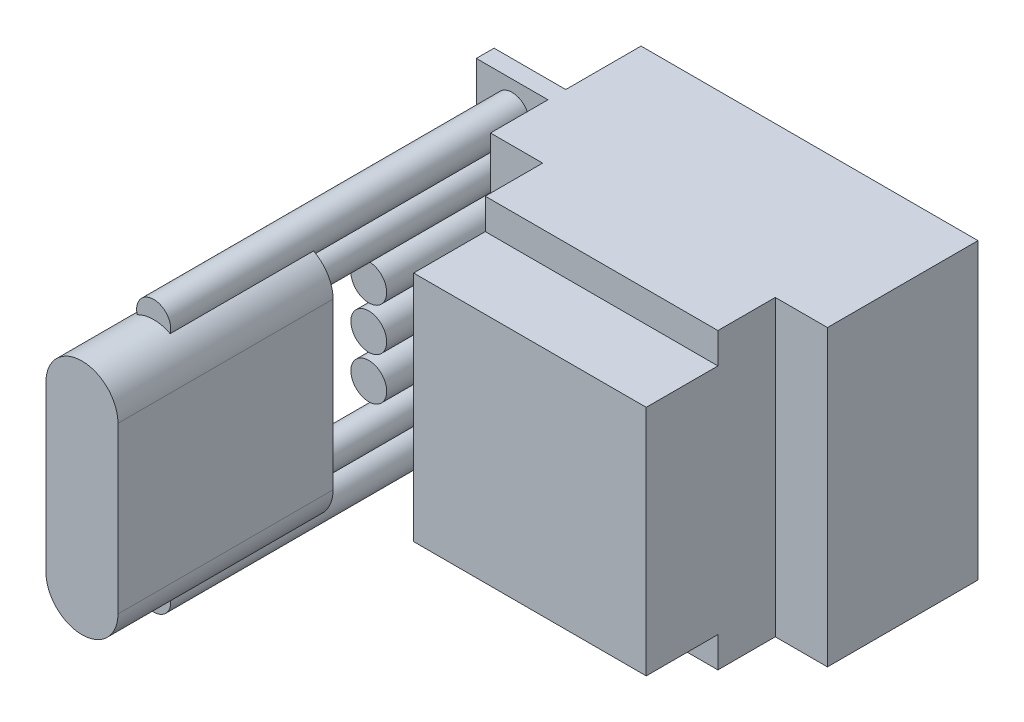
ISO-10303-21;
HEADER;
FILE_DESCRIPTION(('STEP AP214'),'2;1');
FILE_NAME('part.step','',(''),(''),'','','');
FILE_SCHEMA(('AUTOMOTIVE_DESIGN { 1 0 10303 214 1 1 1 1 }'));
ENDSEC;
DATA;
#1=APPLICATION_CONTEXT('core data for automotive mechanical design processes');
#2=APPLICATION_PROTOCOL_DEFINITION('international standard','automotive_design',2000,#1);
#3=PRODUCT_CONTEXT('',#1,'mechanical');
#4=PRODUCT('Part','Part','',(#3));
#5=PRODUCT_RELATED_PRODUCT_CATEGORY('part','',(#4));
#6=PRODUCT_DEFINITION_FORMATION('','',#4);
#7=PRODUCT_DEFINITION_CONTEXT('part definition',#1,'design');
#8=PRODUCT_DEFINITION('design','',#6,#7);
#9=PRODUCT_DEFINITION_SHAPE('','',#8);
#10=(LENGTH_UNIT() NAMED_UNIT(*) SI_UNIT(.MILLI.,.METRE.));
#11=(NAMED_UNIT(*) PLANE_ANGLE_UNIT() SI_UNIT($,.RADIAN.));
#12=(NAMED_UNIT(*) SI_UNIT($,.STERADIAN.) SOLID_ANGLE_UNIT());
#13=UNCERTAINTY_MEASURE_WITH_UNIT(LENGTH_MEASURE(1.E-05),#10,'distance_accuracy_value','');
#14=(GEOMETRIC_REPRESENTATION_CONTEXT(3) GLOBAL_UNCERTAINTY_ASSIGNED_CONTEXT((#13)) GLOBAL_UNIT_ASSIGNED_CONTEXT((#10,
#11,#12)) REPRESENTATION_CONTEXT('',''));
#15=CARTESIAN_POINT('',(0.,0.,0.));
#16=DIRECTION('',(0.,0.,1.));
#17=DIRECTION('',(1.,0.,0.));
#18=AXIS2_PLACEMENT_3D('',#15,#16,#17);
#19=CARTESIAN_POINT('',(-28.5,16.509831398852,62.9776584415119));
#20=DIRECTION('',(0.,0.,-1.));
#21=DIRECTION('',(-1.,0.,0.));
#22=AXIS2_PLACEMENT_3D('',#19,#20,#21);
#23=CYLINDRICAL_SURFACE('',#22,2.3815175463123);
#24=CARTESIAN_POINT('',(-28.5,16.509831398852,12.9776584415119));
#25=DIRECTION('',(0.,0.,-1.));
#26=DIRECTION('',(-1.,0.,0.));
#27=AXIS2_PLACEMENT_3D('',#24,#25,#26);
#28=CIRCLE('',#27,2.3815175463123);
#29=CARTESIAN_POINT('',(-30.8815175463123,16.509831398852,12.9776584415119));
#30=VERTEX_POINT('',#29);
#31=EDGE_CURVE('E284',#30,#30,#28,.F.);
#32=ORIENTED_EDGE('',*,*,#31,.T.);
#33=EDGE_LOOP('',(#32));
#34=FACE_BOUND('',#33,.T.);
#35=DIRECTION('',(0.,0.,-1.));
#36=VECTOR('',#35,1.);
#37=CARTESIAN_POINT('',(-30.7998442399467,15.8914930647846,57.9776584415119));
#38=LINE('',#37,#36);
#39=CARTESIAN_POINT('',(-30.7998442399467,15.8914930647846,62.9776584415119));
#40=VERTEX_POINT('',#39);
#41=CARTESIAN_POINT('',(-30.7998442399467,15.8914930647846,42.9776584415119));
#42=VERTEX_POINT('',#41);
#43=EDGE_CURVE('E235',#40,#42,#38,.T.);
#44=ORIENTED_EDGE('',*,*,#43,.F.);
#45=CARTESIAN_POINT('',(-28.5,16.509831398852,62.9776584415119));
#46=DIRECTION('',(0.,0.,1.));
#47=DIRECTION('',(1.,0.,0.));
#48=AXIS2_PLACEMENT_3D('',#45,#46,#47);
#49=CIRCLE('',#48,2.3815175463123);
#50=CARTESIAN_POINT('',(-26.2001557600533,15.8914930647846,62.9776584415119));
#51=VERTEX_POINT('',#50);
#52=EDGE_CURVE('E254',#51,#40,#49,.T.);
#53=ORIENTED_EDGE('',*,*,#52,.F.);
#54=DIRECTION('',(0.,0.,-1.));
#55=VECTOR('',#54,1.);
#56=CARTESIAN_POINT('',(-26.2001557600533,15.8914930647846,57.9776584415119));
#57=LINE('',#56,#55);
#58=CARTESIAN_POINT('',(-26.2001557600533,15.8914930647846,42.9776584415119));
#59=VERTEX_POINT('',#58);
#60=EDGE_CURVE('E50',#59,#51,#57,.F.);
#61=ORIENTED_EDGE('',*,*,#60,.F.);
#62=CARTESIAN_POINT('',(-28.5,16.509831398852,42.9776584415119));
#63=DIRECTION('',(0.,0.,1.));
#64=DIRECTION('',(1.,0.,0.));
#65=AXIS2_PLACEMENT_3D('',#62,#63,#64);
#66=CIRCLE('',#65,2.3815175463123);
#67=EDGE_CURVE('E223',#42,#59,#66,.T.);
#68=ORIENTED_EDGE('',*,*,#67,.F.);
#69=EDGE_LOOP('',(#44,#53,#61,#68));
#70=FACE_BOUND('',#69,.T.);
#71=ADVANCED_FACE('F35',(#34,#70),#23,.T.);
#72=CARTESIAN_POINT('',(-28.5,16.509831398852,62.9776584415119));
#73=DIRECTION('',(0.,0.,1.));
#74=DIRECTION('',(1.,0.,0.));
#75=AXIS2_PLACEMENT_3D('',#72,#73,#74);
#76=PLANE('',#75);
#77=ORIENTED_EDGE('',*,*,#52,.T.);
#78=CARTESIAN_POINT('',(-28.5,11.4298832761282,62.9776584415119));
#79=DIRECTION('',(0.,0.,1.));
#80=DIRECTION('',(1.,0.,0.));
#81=AXIS2_PLACEMENT_3D('',#78,#79,#80);
#82=CIRCLE('',#81,5.01948657078104);
#83=EDGE_CURVE('E11',#40,#51,#82,.F.);
#84=ORIENTED_EDGE('',*,*,#83,.T.);
#85=EDGE_LOOP('',(#77,#84));
#86=FACE_BOUND('',#85,.T.);
#87=ADVANCED_FACE('F340',(#86),#76,.T.);
#88=CARTESIAN_POINT('',(-28.5,-16.509831398852,62.9776584415119));
#89=DIRECTION('',(0.,0.,-1.));
#90=DIRECTION('',(-1.,0.,0.));
#91=AXIS2_PLACEMENT_3D('',#88,#89,#90);
#92=CYLINDRICAL_SURFACE('',#91,2.38151754631231);
#93=CARTESIAN_POINT('',(-28.5,-16.509831398852,12.9776584415119));
#94=DIRECTION('',(0.,0.,-1.));
#95=DIRECTION('',(-1.,0.,0.));
#96=AXIS2_PLACEMENT_3D('',#93,#94,#95);
#97=CIRCLE('',#96,2.38151754631231);
#98=CARTESIAN_POINT('',(-30.8815175463123,-16.509831398852,12.9776584415119));
#99=VERTEX_POINT('',#98);
#100=EDGE_CURVE('E287',#99,#99,#97,.F.);
#101=ORIENTED_EDGE('',*,*,#100,.T.);
#102=EDGE_LOOP('',(#101));
#103=FACE_BOUND('',#102,.T.);
#104=DIRECTION('',(0.,0.,-1.));
#105=VECTOR('',#104,1.);
#106=CARTESIAN_POINT('',(-26.1637491583184,-16.047708224649,57.9776584415119));
#107=LINE('',#106,#105);
#108=CARTESIAN_POINT('',(-26.1637491583184,-16.047708224649,62.9776584415119));
#109=VERTEX_POINT('',#108);
#110=CARTESIAN_POINT('',(-26.1637491583184,-16.047708224649,42.9776584415119));
#111=VERTEX_POINT('',#110);
#112=EDGE_CURVE('E231',#109,#111,#107,.T.);
#113=ORIENTED_EDGE('',*,*,#112,.F.);
#114=CARTESIAN_POINT('',(-28.5,-16.509831398852,62.9776584415119));
#115=DIRECTION('',(0.,0.,1.));
#116=DIRECTION('',(-1.,0.,0.));
#117=AXIS2_PLACEMENT_3D('',#114,#115,#116);
#118=CIRCLE('',#117,2.38151754631231);
#119=CARTESIAN_POINT('',(-30.8362508416816,-16.047708224649,62.9776584415119));
#120=VERTEX_POINT('',#119);
#121=EDGE_CURVE('E252',#120,#109,#118,.T.);
#122=ORIENTED_EDGE('',*,*,#121,.F.);
#123=DIRECTION('',(0.,0.,-1.));
#124=VECTOR('',#123,1.);
#125=CARTESIAN_POINT('',(-30.8362508416816,-16.047708224649,57.9776584415119));
#126=LINE('',#125,#124);
#127=CARTESIAN_POINT('',(-30.8362508416816,-16.047708224649,42.9776584415119));
#128=VERTEX_POINT('',#127);
#129=EDGE_CURVE('E57',#128,#120,#126,.F.);
#130=ORIENTED_EDGE('',*,*,#129,.F.);
#131=CARTESIAN_POINT('',(-28.5,-16.509831398852,42.9776584415119));
#132=DIRECTION('',(0.,0.,1.));
#133=DIRECTION('',(1.,0.,0.));
#134=AXIS2_PLACEMENT_3D('',#131,#132,#133);
#135=CIRCLE('',#134,2.38151754631231);
#136=EDGE_CURVE('E221',#111,#128,#135,.T.);
#137=ORIENTED_EDGE('',*,*,#136,.F.);
#138=EDGE_LOOP('',(#113,#122,#130,#137));
#139=FACE_BOUND('',#138,.T.);
#140=ADVANCED_FACE('F313',(#103,#139),#92,.T.);
#141=CARTESIAN_POINT('',(-28.5,-16.509831398852,62.9776584415119));
#142=DIRECTION('',(0.,0.,-1.));
#143=DIRECTION('',(-1.,0.,0.));
#144=AXIS2_PLACEMENT_3D('',#141,#142,#143);
#145=PLANE('',#144);
#146=CARTESIAN_POINT('',(-28.5,-11.60505390105,62.9776584415119));
#147=DIRECTION('',(0.,0.,-1.));
#148=DIRECTION('',(-1.,0.,0.));
#149=AXIS2_PLACEMENT_3D('',#146,#147,#148);
#150=CIRCLE('',#149,5.01948657078104);
#151=EDGE_CURVE('E43',#120,#109,#150,.F.);
#152=ORIENTED_EDGE('',*,*,#151,.F.);
#153=ORIENTED_EDGE('',*,*,#121,.T.);
#154=EDGE_LOOP('',(#152,#153));
#155=FACE_BOUND('',#154,.T.);
#156=ADVANCED_FACE('F312',(#155),#145,.F.);
#157=CARTESIAN_POINT('',(-33.5,20.5,12.9776584415119));
#158=DIRECTION('',(0.,0.,-1.));
#159=DIRECTION('',(-1.,0.,0.));
#160=AXIS2_PLACEMENT_3D('',#157,#158,#159);
#161=PLANE('',#160);
#162=CARTESIAN_POINT('',(-28.5,11.4298832761282,12.9776584415119));
#163=DIRECTION('',(0.,0.,-1.));
#164=DIRECTION('',(-1.,0.,0.));
#165=AXIS2_PLACEMENT_3D('',#162,#163,#164);
#166=CIRCLE('',#165,2.21873148494922);
#167=CARTESIAN_POINT('',(-30.7187314849492,11.4298832761282,12.9776584415119));
#168=VERTEX_POINT('',#167);
#169=EDGE_CURVE('E300',#168,#168,#166,.F.);
#170=ORIENTED_EDGE('',*,*,#169,.F.);
#171=EDGE_LOOP('',(#170));
#172=FACE_BOUND('',#171,.T.);
#173=CARTESIAN_POINT('',(-28.5,0.,12.9776584415119));
#174=DIRECTION('',(0.,0.,-1.));
#175=DIRECTION('',(-1.,0.,0.));
#176=AXIS2_PLACEMENT_3D('',#173,#174,#175);
#177=CIRCLE('',#176,2.5);
#178=CARTESIAN_POINT('',(-31.,0.,12.9776584415119));
#179=VERTEX_POINT('',#178);
#180=EDGE_CURVE('E294',#179,#179,#177,.F.);
#181=ORIENTED_EDGE('',*,*,#180,.F.);
#182=EDGE_LOOP('',(#181));
#183=FACE_BOUND('',#182,.T.);
#184=ORIENTED_EDGE('',*,*,#100,.F.);
#185=EDGE_LOOP('',(#184));
#186=FACE_BOUND('',#185,.T.);
#187=DIRECTION('',(0.,1.,0.));
#188=VECTOR('',#187,1.);
#189=CARTESIAN_POINT('',(-23.5,20.5,12.9776584415119));
#190=LINE('',#189,#188);
#191=CARTESIAN_POINT('',(-23.5,-20.5,12.9776584415119));
#192=VERTEX_POINT('',#191);
#193=CARTESIAN_POINT('',(-23.5,20.5,12.9776584415119));
#194=VERTEX_POINT('',#193);
#195=EDGE_CURVE('E262',#192,#194,#190,.T.);
#196=ORIENTED_EDGE('',*,*,#195,.T.);
#197=DIRECTION('',(1.,0.,0.));
#198=VECTOR('',#197,1.);
#199=CARTESIAN_POINT('',(-33.5,20.5,12.9776584415119));
#200=LINE('',#199,#198);
#201=CARTESIAN_POINT('',(-33.5,20.5,12.9776584415119));
#202=VERTEX_POINT('',#201);
#203=EDGE_CURVE('E281',#202,#194,#200,.T.);
#204=ORIENTED_EDGE('',*,*,#203,.F.);
#205=DIRECTION('',(0.,1.,0.));
#206=VECTOR('',#205,1.);
#207=CARTESIAN_POINT('',(-33.5,20.5,12.9776584415119));
#208=LINE('',#207,#206);
#209=CARTESIAN_POINT('',(-33.5,-20.5,12.9776584415119));
#210=VERTEX_POINT('',#209);
#211=EDGE_CURVE('E264',#210,#202,#208,.T.);
#212=ORIENTED_EDGE('',*,*,#211,.F.);
#213=DIRECTION('',(1.,0.,0.));
#214=VECTOR('',#213,1.);
#215=CARTESIAN_POINT('',(-33.5,-20.5,12.9776584415119));
#216=LINE('',#215,#214);
#217=EDGE_CURVE('E534',#210,#192,#216,.T.);
#218=ORIENTED_EDGE('',*,*,#217,.T.);
#219=EDGE_LOOP('',(#196,#204,#212,#218));
#220=FACE_BOUND('',#219,.T.);
#221=ORIENTED_EDGE('',*,*,#31,.F.);
#222=EDGE_LOOP('',(#221));
#223=FACE_BOUND('',#222,.T.);
#224=CARTESIAN_POINT('',(-28.5,5.96977176155851,12.9776584415119));
#225=DIRECTION('',(0.,0.,-1.));
#226=DIRECTION('',(-1.,0.,0.));
#227=AXIS2_PLACEMENT_3D('',#224,#225,#226);
#228=CIRCLE('',#227,2.5);
#229=CARTESIAN_POINT('',(-31.,5.96977176155851,12.9776584415119));
#230=VERTEX_POINT('',#229);
#231=EDGE_CURVE('E291',#230,#230,#228,.F.);
#232=ORIENTED_EDGE('',*,*,#231,.F.);
#233=EDGE_LOOP('',(#232));
#234=FACE_BOUND('',#233,.T.);
#235=CARTESIAN_POINT('',(-28.5,-5.97705754577565,12.9776584415119));
#236=DIRECTION('',(0.,0.,-1.));
#237=DIRECTION('',(-1.,0.,0.));
#238=AXIS2_PLACEMENT_3D('',#235,#236,#237);
#239=CIRCLE('',#238,2.5);
#240=CARTESIAN_POINT('',(-31.,-5.97705754577565,12.9776584415119));
#241=VERTEX_POINT('',#240);
#242=EDGE_CURVE('E297',#241,#241,#239,.F.);
#243=ORIENTED_EDGE('',*,*,#242,.F.);
#244=EDGE_LOOP('',(#243));
#245=FACE_BOUND('',#244,.T.);
#246=CARTESIAN_POINT('',(-28.5,-11.60505390105,12.9776584415119));
#247=DIRECTION('',(0.,0.,-1.));
#248=DIRECTION('',(-1.,0.,0.));
#249=AXIS2_PLACEMENT_3D('',#246,#247,#248);
#250=CIRCLE('',#249,2.10700845368441);
#251=CARTESIAN_POINT('',(-30.6070084536844,-11.60505390105,12.9776584415119));
#252=VERTEX_POINT('',#251);
#253=EDGE_CURVE('E303',#252,#252,#250,.F.);
#254=ORIENTED_EDGE('',*,*,#253,.F.);
#255=EDGE_LOOP('',(#254));
#256=FACE_BOUND('',#255,.T.);
#257=ADVANCED_FACE('F359',(#172,#183,#186,#220,#223,#234,#245,#256),#161,.F.);
#258=CARTESIAN_POINT('',(-23.5,20.5,29.));
#259=DIRECTION('',(1.,0.,0.));
#260=DIRECTION('',(0.,1.,0.));
#261=AXIS2_PLACEMENT_3D('',#258,#259,#260);
#262=PLANE('',#261);
#263=DIRECTION('',(0.,-1.,0.));
#264=VECTOR('',#263,1.);
#265=CARTESIAN_POINT('',(-23.5,20.5,10.5));
#266=LINE('',#265,#264);
#267=CARTESIAN_POINT('',(-23.5,20.5,10.5));
#268=VERTEX_POINT('',#267);
#269=CARTESIAN_POINT('',(-23.5,-20.5,10.5));
#270=VERTEX_POINT('',#269);
#271=EDGE_CURVE('E257',#268,#270,#266,.T.);
#272=ORIENTED_EDGE('',*,*,#271,.F.);
#273=DIRECTION('',(0.,0.,-1.));
#274=VECTOR('',#273,1.);
#275=CARTESIAN_POINT('',(-23.5,20.5,29.));
#276=LINE('',#275,#274);
#277=CARTESIAN_POINT('',(-23.5,20.5,0.));
#278=VERTEX_POINT('',#277);
#279=EDGE_CURVE('E462',#268,#278,#276,.T.);
#280=ORIENTED_EDGE('',*,*,#279,.T.);
#281=DIRECTION('',(0.,-1.,0.));
#282=VECTOR('',#281,1.);
#283=CARTESIAN_POINT('',(-23.5,20.5,0.));
#284=LINE('',#283,#282);
#285=CARTESIAN_POINT('',(-23.5,-20.5,0.));
#286=VERTEX_POINT('',#285);
#287=EDGE_CURVE('E435',#278,#286,#284,.T.);
#288=ORIENTED_EDGE('',*,*,#287,.T.);
#289=DIRECTION('',(0.,0.,-1.));
#290=VECTOR('',#289,1.);
#291=CARTESIAN_POINT('',(-23.5,-20.5,29.));
#292=LINE('',#291,#290);
#293=EDGE_CURVE('E450',#270,#286,#292,.T.);
#294=ORIENTED_EDGE('',*,*,#293,.F.);
#295=EDGE_LOOP('',(#272,#280,#288,#294));
#296=FACE_BOUND('',#295,.T.);
#297=ADVANCED_FACE('F362',(#296),#262,.F.);
#298=ORIENTED_EDGE('',*,*,#195,.F.);
#299=CARTESIAN_POINT('',(-23.5,-20.5,21.));
#300=VERTEX_POINT('',#299);
#301=EDGE_CURVE('E459',#300,#192,#292,.T.);
#302=ORIENTED_EDGE('',*,*,#301,.F.);
#303=DIRECTION('',(0.,-1.,0.));
#304=VECTOR('',#303,1.);
#305=CARTESIAN_POINT('',(-23.5,20.5,21.));
#306=LINE('',#305,#304);
#307=CARTESIAN_POINT('',(-23.5,20.5,21.));
#308=VERTEX_POINT('',#307);
#309=EDGE_CURVE('E565',#308,#300,#306,.T.);
#310=ORIENTED_EDGE('',*,*,#309,.F.);
#311=EDGE_CURVE('E464',#308,#194,#276,.T.);
#312=ORIENTED_EDGE('',*,*,#311,.T.);
#313=EDGE_LOOP('',(#298,#302,#310,#312));
#314=FACE_BOUND('',#313,.T.);
#315=ADVANCED_FACE('F410',(#314),#262,.F.);
#316=CARTESIAN_POINT('',(0.,0.,29.));
#317=DIRECTION('',(0.,0.,1.));
#318=DIRECTION('',(1.,0.,0.));
#319=AXIS2_PLACEMENT_3D('',#316,#317,#318);
#320=PLANE('',#319);
#321=DIRECTION('',(1.,0.,0.));
#322=VECTOR('',#321,1.);
#323=CARTESIAN_POINT('',(-16.2243359347136,-16.2243359347136,29.));
#324=LINE('',#323,#322);
#325=CARTESIAN_POINT('',(-16.2243359347136,-16.2243359347136,29.));
#326=VERTEX_POINT('',#325);
#327=CARTESIAN_POINT('',(16.2243359347136,-16.2243359347136,29.));
#328=VERTEX_POINT('',#327);
#329=EDGE_CURVE('E478',#326,#328,#324,.T.);
#330=ORIENTED_EDGE('',*,*,#329,.F.);
#331=DIRECTION('',(0.,1.,0.));
#332=VECTOR('',#331,1.);
#333=CARTESIAN_POINT('',(-16.2243359347136,20.5,29.));
#334=LINE('',#333,#332);
#335=CARTESIAN_POINT('',(-16.2243359347136,-20.5,29.));
#336=VERTEX_POINT('',#335);
#337=EDGE_CURVE('E563',#336,#326,#334,.T.);
#338=ORIENTED_EDGE('',*,*,#337,.F.);
#339=DIRECTION('',(1.,0.,0.));
#340=VECTOR('',#339,1.);
#341=CARTESIAN_POINT('',(-23.5,-20.5,29.));
#342=LINE('',#341,#340);
#343=CARTESIAN_POINT('',(16.2243359347136,-20.5,29.));
#344=VERTEX_POINT('',#343);
#345=EDGE_CURVE('E428',#336,#344,#342,.T.);
#346=ORIENTED_EDGE('',*,*,#345,.T.);
#347=DIRECTION('',(0.,-1.,0.));
#348=VECTOR('',#347,1.);
#349=CARTESIAN_POINT('',(16.2243359347136,20.5,29.));
#350=LINE('',#349,#348);
#351=EDGE_CURVE('E508',#328,#344,#350,.T.);
#352=ORIENTED_EDGE('',*,*,#351,.F.);
#353=EDGE_LOOP('',(#330,#338,#346,#352));
#354=FACE_BOUND('',#353,.T.);
#355=ADVANCED_FACE('F401',(#354),#320,.T.);
#356=CARTESIAN_POINT('',(23.5,20.5,29.));
#357=DIRECTION('',(-1.,0.,0.));
#358=DIRECTION('',(0.,-1.,0.));
#359=AXIS2_PLACEMENT_3D('',#356,#357,#358);
#360=PLANE('',#359);
#361=DIRECTION('',(0.,1.,0.));
#362=VECTOR('',#361,1.);
#363=CARTESIAN_POINT('',(23.5,20.5,21.));
#364=LINE('',#363,#362);
#365=CARTESIAN_POINT('',(23.5,-20.5,21.));
#366=VERTEX_POINT('',#365);
#367=CARTESIAN_POINT('',(23.5,20.5,21.));
#368=VERTEX_POINT('',#367);
#369=EDGE_CURVE('E500',#366,#368,#364,.T.);
#370=ORIENTED_EDGE('',*,*,#369,.F.);
#371=DIRECTION('',(0.,0.,-1.));
#372=VECTOR('',#371,1.);
#373=CARTESIAN_POINT('',(23.5,-20.5,29.));
#374=LINE('',#373,#372);
#375=CARTESIAN_POINT('',(23.5,-20.5,0.));
#376=VERTEX_POINT('',#375);
#377=EDGE_CURVE('E432',#366,#376,#374,.T.);
#378=ORIENTED_EDGE('',*,*,#377,.T.);
#379=DIRECTION('',(0.,1.,0.));
#380=VECTOR('',#379,1.);
#381=CARTESIAN_POINT('',(23.5,20.5,0.));
#382=LINE('',#381,#380);
#383=CARTESIAN_POINT('',(23.5,20.5,0.));
#384=VERTEX_POINT('',#383);
#385=EDGE_CURVE('E441',#376,#384,#382,.T.);
#386=ORIENTED_EDGE('',*,*,#385,.T.);
#387=DIRECTION('',(0.,0.,-1.));
#388=VECTOR('',#387,1.);
#389=CARTESIAN_POINT('',(23.5,20.5,29.));
#390=LINE('',#389,#388);
#391=EDGE_CURVE('E288',#368,#384,#390,.T.);
#392=ORIENTED_EDGE('',*,*,#391,.F.);
#393=EDGE_LOOP('',(#370,#378,#386,#392));
#394=FACE_BOUND('',#393,.T.);
#395=ADVANCED_FACE('F37',(#394),#360,.F.);
#396=CARTESIAN_POINT('',(-23.5,20.5,29.));
#397=DIRECTION('',(0.,-1.,0.));
#398=DIRECTION('',(0.,0.,-1.));
#399=AXIS2_PLACEMENT_3D('',#396,#397,#398);
#400=PLANE('',#399);
#401=DIRECTION('',(-1.,0.,0.));
#402=VECTOR('',#401,1.);
#403=CARTESIAN_POINT('',(-23.5,20.5,29.));
#404=LINE('',#403,#402);
#405=CARTESIAN_POINT('',(16.2243359347137,20.5,29.));
#406=VERTEX_POINT('',#405);
#407=CARTESIAN_POINT('',(-16.2243359347136,20.5,29.));
#408=VERTEX_POINT('',#407);
#409=EDGE_CURVE('E422',#406,#408,#404,.T.);
#410=ORIENTED_EDGE('',*,*,#409,.F.);
#411=DIRECTION('',(0.,0.,1.));
#412=VECTOR('',#411,1.);
#413=CARTESIAN_POINT('',(16.2243359347136,20.5,21.));
#414=LINE('',#413,#412);
#415=CARTESIAN_POINT('',(16.2243359347136,20.5,21.));
#416=VERTEX_POINT('',#415);
#417=EDGE_CURVE('E424',#416,#406,#414,.T.);
#418=ORIENTED_EDGE('',*,*,#417,.F.);
#419=DIRECTION('',(-1.,0.,0.));
#420=VECTOR('',#419,1.);
#421=CARTESIAN_POINT('',(23.5,20.5,21.));
#422=LINE('',#421,#420);
#423=EDGE_CURVE('E491',#368,#416,#422,.T.);
#424=ORIENTED_EDGE('',*,*,#423,.F.);
#425=ORIENTED_EDGE('',*,*,#391,.T.);
#426=DIRECTION('',(-1.,0.,0.));
#427=VECTOR('',#426,1.);
#428=CARTESIAN_POINT('',(-23.5,20.5,0.));
#429=LINE('',#428,#427);
#430=EDGE_CURVE('E444',#384,#278,#429,.T.);
#431=ORIENTED_EDGE('',*,*,#430,.T.);
#432=ORIENTED_EDGE('',*,*,#279,.F.);
#433=DIRECTION('',(1.,0.,0.));
#434=VECTOR('',#433,1.);
#435=CARTESIAN_POINT('',(-33.5,20.5,10.5));
#436=LINE('',#435,#434);
#437=CARTESIAN_POINT('',(-33.5,20.5,10.5));
#438=VERTEX_POINT('',#437);
#439=EDGE_CURVE('E268',#438,#268,#436,.T.);
#440=ORIENTED_EDGE('',*,*,#439,.F.);
#441=DIRECTION('',(0.,0.,-1.));
#442=VECTOR('',#441,1.);
#443=CARTESIAN_POINT('',(-33.5,20.5,10.5));
#444=LINE('',#443,#442);
#445=EDGE_CURVE('E266',#202,#438,#444,.T.);
#446=ORIENTED_EDGE('',*,*,#445,.F.);
#447=ORIENTED_EDGE('',*,*,#203,.T.);
#448=ORIENTED_EDGE('',*,*,#311,.F.);
#449=DIRECTION('',(-1.,0.,0.));
#450=VECTOR('',#449,1.);
#451=CARTESIAN_POINT('',(-23.5,20.5,21.));
#452=LINE('',#451,#450);
#453=CARTESIAN_POINT('',(-16.2243359347136,20.5,21.));
#454=VERTEX_POINT('',#453);
#455=EDGE_CURVE('E570',#454,#308,#452,.T.);
#456=ORIENTED_EDGE('',*,*,#455,.F.);
#457=DIRECTION('',(0.,0.,1.));
#458=VECTOR('',#457,1.);
#459=CARTESIAN_POINT('',(-16.2243359347136,20.5,21.));
#460=LINE('',#459,#458);
#461=EDGE_CURVE('E426',#454,#408,#460,.T.);
#462=ORIENTED_EDGE('',*,*,#461,.T.);
#463=EDGE_LOOP('',(#410,#418,#424,#425,#431,#432,#440,#446,#447,#448,#456,#462));
#464=FACE_BOUND('',#463,.T.);
#465=ADVANCED_FACE('F407',(#464),#400,.F.);
#466=CARTESIAN_POINT('',(-23.5,-20.5,29.));
#467=DIRECTION('',(0.,1.,0.));
#468=DIRECTION('',(0.,0.,1.));
#469=AXIS2_PLACEMENT_3D('',#466,#467,#468);
#470=PLANE('',#469);
#471=DIRECTION('',(1.,0.,0.));
#472=VECTOR('',#471,1.);
#473=CARTESIAN_POINT('',(23.5,-20.5,21.));
#474=LINE('',#473,#472);
#475=CARTESIAN_POINT('',(16.2243359347136,-20.5,21.));
#476=VERTEX_POINT('',#475);
#477=EDGE_CURVE('E498',#476,#366,#474,.T.);
#478=ORIENTED_EDGE('',*,*,#477,.F.);
#479=DIRECTION('',(0.,0.,1.));
#480=VECTOR('',#479,1.);
#481=CARTESIAN_POINT('',(16.2243359347136,-20.5,21.));
#482=LINE('',#481,#480);
#483=EDGE_CURVE('E504',#476,#344,#482,.T.);
#484=ORIENTED_EDGE('',*,*,#483,.T.);
#485=ORIENTED_EDGE('',*,*,#345,.F.);
#486=DIRECTION('',(0.,0.,1.));
#487=VECTOR('',#486,1.);
#488=CARTESIAN_POINT('',(-16.2243359347136,-20.5,21.));
#489=LINE('',#488,#487);
#490=CARTESIAN_POINT('',(-16.2243359347136,-20.5,21.));
#491=VERTEX_POINT('',#490);
#492=EDGE_CURVE('E438',#491,#336,#489,.T.);
#493=ORIENTED_EDGE('',*,*,#492,.F.);
#494=DIRECTION('',(1.,0.,0.));
#495=VECTOR('',#494,1.);
#496=CARTESIAN_POINT('',(-23.5,-20.5,21.));
#497=LINE('',#496,#495);
#498=EDGE_CURVE('E566',#300,#491,#497,.T.);
#499=ORIENTED_EDGE('',*,*,#498,.F.);
#500=ORIENTED_EDGE('',*,*,#301,.T.);
#501=ORIENTED_EDGE('',*,*,#217,.F.);
#502=DIRECTION('',(0.,0.,1.));
#503=VECTOR('',#502,1.);
#504=CARTESIAN_POINT('',(-33.5,-20.5,10.5));
#505=LINE('',#504,#503);
#506=CARTESIAN_POINT('',(-33.5,-20.5,10.5));
#507=VERTEX_POINT('',#506);
#508=EDGE_CURVE('E261',#507,#210,#505,.T.);
#509=ORIENTED_EDGE('',*,*,#508,.F.);
#510=DIRECTION('',(1.,0.,0.));
#511=VECTOR('',#510,1.);
#512=CARTESIAN_POINT('',(-33.5,-20.5,10.5));
#513=LINE('',#512,#511);
#514=EDGE_CURVE('E523',#507,#270,#513,.T.);
#515=ORIENTED_EDGE('',*,*,#514,.T.);
#516=ORIENTED_EDGE('',*,*,#293,.T.);
#517=DIRECTION('',(1.,0.,0.));
#518=VECTOR('',#517,1.);
#519=CARTESIAN_POINT('',(-23.5,-20.5,0.));
#520=LINE('',#519,#518);
#521=EDGE_CURVE('E429',#286,#376,#520,.T.);
#522=ORIENTED_EDGE('',*,*,#521,.T.);
#523=ORIENTED_EDGE('',*,*,#377,.F.);
#524=EDGE_LOOP('',(#478,#484,#485,#493,#499,#500,#501,#509,#515,#516,#522,#523));
#525=FACE_BOUND('',#524,.T.);
#526=ADVANCED_FACE('F399',(#525),#470,.F.);
#527=DIRECTION('',(-1.,0.,0.));
#528=VECTOR('',#527,1.);
#529=CARTESIAN_POINT('',(-16.2243359347136,16.2243359347136,29.));
#530=LINE('',#529,#528);
#531=CARTESIAN_POINT('',(16.2243359347136,16.2243359347136,29.));
#532=VERTEX_POINT('',#531);
#533=CARTESIAN_POINT('',(-16.2243359347136,16.2243359347136,29.));
#534=VERTEX_POINT('',#533);
#535=EDGE_CURVE('E483',#532,#534,#530,.T.);
#536=ORIENTED_EDGE('',*,*,#535,.F.);
#537=EDGE_CURVE('E495',#406,#532,#350,.T.);
#538=ORIENTED_EDGE('',*,*,#537,.F.);
#539=ORIENTED_EDGE('',*,*,#409,.T.);
#540=EDGE_CURVE('E549',#534,#408,#334,.T.);
#541=ORIENTED_EDGE('',*,*,#540,.F.);
#542=EDGE_LOOP('',(#536,#538,#539,#541));
#543=FACE_BOUND('',#542,.T.);
#544=ADVANCED_FACE('F396',(#543),#320,.T.);
#545=CARTESIAN_POINT('',(0.,0.,0.));
#546=DIRECTION('',(0.,0.,1.));
#547=DIRECTION('',(1.,0.,0.));
#548=AXIS2_PLACEMENT_3D('',#545,#546,#547);
#549=PLANE('',#548);
#550=ORIENTED_EDGE('',*,*,#385,.F.);
#551=ORIENTED_EDGE('',*,*,#521,.F.);
#552=ORIENTED_EDGE('',*,*,#287,.F.);
#553=ORIENTED_EDGE('',*,*,#430,.F.);
#554=EDGE_LOOP('',(#550,#551,#552,#553));
#555=FACE_BOUND('',#554,.T.);
#556=ADVANCED_FACE('F394',(#555),#549,.F.);
#557=CARTESIAN_POINT('',(-16.2243359347136,20.5,21.));
#558=DIRECTION('',(1.,0.,0.));
#559=DIRECTION('',(0.,0.,-1.));
#560=AXIS2_PLACEMENT_3D('',#557,#558,#559);
#561=PLANE('',#560);
#562=ORIENTED_EDGE('',*,*,#337,.T.);
#563=DIRECTION('',(0.,0.,-1.));
#564=VECTOR('',#563,1.);
#565=CARTESIAN_POINT('',(-16.2243359347136,-16.2243359347136,39.));
#566=LINE('',#565,#564);
#567=CARTESIAN_POINT('',(-16.2243359347136,-16.2243359347136,39.));
#568=VERTEX_POINT('',#567);
#569=EDGE_CURVE('E468',#568,#326,#566,.T.);
#570=ORIENTED_EDGE('',*,*,#569,.F.);
#571=DIRECTION('',(0.,-1.,0.));
#572=VECTOR('',#571,1.);
#573=CARTESIAN_POINT('',(-16.2243359347136,16.2243359347136,39.));
#574=LINE('',#573,#572);
#575=CARTESIAN_POINT('',(-16.2243359347136,16.2243359347136,39.));
#576=VERTEX_POINT('',#575);
#577=EDGE_CURVE('E579',#576,#568,#574,.T.);
#578=ORIENTED_EDGE('',*,*,#577,.F.);
#579=DIRECTION('',(0.,0.,-1.));
#580=VECTOR('',#579,1.);
#581=CARTESIAN_POINT('',(-16.2243359347136,16.2243359347136,39.));
#582=LINE('',#581,#580);
#583=EDGE_CURVE('E471',#576,#534,#582,.T.);
#584=ORIENTED_EDGE('',*,*,#583,.T.);
#585=ORIENTED_EDGE('',*,*,#540,.T.);
#586=ORIENTED_EDGE('',*,*,#461,.F.);
#587=DIRECTION('',(0.,1.,0.));
#588=VECTOR('',#587,1.);
#589=CARTESIAN_POINT('',(-16.2243359347136,20.5,21.));
#590=LINE('',#589,#588);
#591=EDGE_CURVE('E573',#491,#454,#590,.T.);
#592=ORIENTED_EDGE('',*,*,#591,.F.);
#593=ORIENTED_EDGE('',*,*,#492,.T.);
#594=EDGE_LOOP('',(#562,#570,#578,#584,#585,#586,#592,#593));
#595=FACE_BOUND('',#594,.T.);
#596=ADVANCED_FACE('F390',(#595),#561,.F.);
#597=CARTESIAN_POINT('',(0.,0.,21.));
#598=DIRECTION('',(0.,0.,1.));
#599=DIRECTION('',(1.,0.,0.));
#600=AXIS2_PLACEMENT_3D('',#597,#598,#599);
#601=PLANE('',#600);
#602=ORIENTED_EDGE('',*,*,#309,.T.);
#603=ORIENTED_EDGE('',*,*,#498,.T.);
#604=ORIENTED_EDGE('',*,*,#591,.T.);
#605=ORIENTED_EDGE('',*,*,#455,.T.);
#606=EDGE_LOOP('',(#602,#603,#604,#605));
#607=FACE_BOUND('',#606,.T.);
#608=ADVANCED_FACE('F386',(#607),#601,.T.);
#609=CARTESIAN_POINT('',(16.2243359347136,20.5,21.));
#610=DIRECTION('',(-1.,0.,0.));
#611=DIRECTION('',(0.,0.,1.));
#612=AXIS2_PLACEMENT_3D('',#609,#610,#611);
#613=PLANE('',#612);
#614=ORIENTED_EDGE('',*,*,#537,.T.);
#615=DIRECTION('',(0.,0.,-1.));
#616=VECTOR('',#615,1.);
#617=CARTESIAN_POINT('',(16.2243359347137,16.2243359347136,39.));
#618=LINE('',#617,#616);
#619=CARTESIAN_POINT('',(16.2243359347137,16.2243359347136,39.));
#620=VERTEX_POINT('',#619);
#621=EDGE_CURVE('E552',#620,#532,#618,.T.);
#622=ORIENTED_EDGE('',*,*,#621,.F.);
#623=DIRECTION('',(0.,1.,0.));
#624=VECTOR('',#623,1.);
#625=CARTESIAN_POINT('',(16.2243359347137,16.2243359347136,39.));
#626=LINE('',#625,#624);
#627=CARTESIAN_POINT('',(16.2243359347137,-16.2243359347136,39.));
#628=VERTEX_POINT('',#627);
#629=EDGE_CURVE('E482',#628,#620,#626,.T.);
#630=ORIENTED_EDGE('',*,*,#629,.F.);
#631=DIRECTION('',(0.,0.,-1.));
#632=VECTOR('',#631,1.);
#633=CARTESIAN_POINT('',(16.2243359347137,-16.2243359347136,39.));
#634=LINE('',#633,#632);
#635=EDGE_CURVE('E472',#628,#328,#634,.T.);
#636=ORIENTED_EDGE('',*,*,#635,.T.);
#637=ORIENTED_EDGE('',*,*,#351,.T.);
#638=ORIENTED_EDGE('',*,*,#483,.F.);
#639=DIRECTION('',(0.,-1.,0.));
#640=VECTOR('',#639,1.);
#641=CARTESIAN_POINT('',(16.2243359347136,20.5,21.));
#642=LINE('',#641,#640);
#643=EDGE_CURVE('E494',#416,#476,#642,.T.);
#644=ORIENTED_EDGE('',*,*,#643,.F.);
#645=ORIENTED_EDGE('',*,*,#417,.T.);
#646=EDGE_LOOP('',(#614,#622,#630,#636,#637,#638,#644,#645));
#647=FACE_BOUND('',#646,.T.);
#648=ADVANCED_FACE('F382',(#647),#613,.F.);
#649=CARTESIAN_POINT('',(0.,0.,21.));
#650=DIRECTION('',(0.,0.,1.));
#651=DIRECTION('',(1.,0.,0.));
#652=AXIS2_PLACEMENT_3D('',#649,#650,#651);
#653=PLANE('',#652);
#654=ORIENTED_EDGE('',*,*,#423,.T.);
#655=ORIENTED_EDGE('',*,*,#643,.T.);
#656=ORIENTED_EDGE('',*,*,#477,.T.);
#657=ORIENTED_EDGE('',*,*,#369,.T.);
#658=EDGE_LOOP('',(#654,#655,#656,#657));
#659=FACE_BOUND('',#658,.T.);
#660=ADVANCED_FACE('F378',(#659),#653,.T.);
#661=CARTESIAN_POINT('',(-16.2243359347136,16.2243359347136,39.));
#662=DIRECTION('',(0.,-1.,0.));
#663=DIRECTION('',(0.,0.,-1.));
#664=AXIS2_PLACEMENT_3D('',#661,#662,#663);
#665=PLANE('',#664);
#666=ORIENTED_EDGE('',*,*,#535,.T.);
#667=ORIENTED_EDGE('',*,*,#583,.F.);
#668=DIRECTION('',(-1.,0.,0.));
#669=VECTOR('',#668,1.);
#670=CARTESIAN_POINT('',(-16.2243359347136,16.2243359347136,39.));
#671=LINE('',#670,#669);
#672=EDGE_CURVE('E580',#620,#576,#671,.T.);
#673=ORIENTED_EDGE('',*,*,#672,.F.);
#674=ORIENTED_EDGE('',*,*,#621,.T.);
#675=EDGE_LOOP('',(#666,#667,#673,#674));
#676=FACE_BOUND('',#675,.T.);
#677=ADVANCED_FACE('F374',(#676),#665,.F.);
#678=CARTESIAN_POINT('',(-16.2243359347136,-16.2243359347136,39.));
#679=DIRECTION('',(0.,1.,0.));
#680=DIRECTION('',(0.,0.,1.));
#681=AXIS2_PLACEMENT_3D('',#678,#679,#680);
#682=PLANE('',#681);
#683=ORIENTED_EDGE('',*,*,#329,.T.);
#684=ORIENTED_EDGE('',*,*,#635,.F.);
#685=DIRECTION('',(1.,0.,0.));
#686=VECTOR('',#685,1.);
#687=CARTESIAN_POINT('',(-16.2243359347136,-16.2243359347136,39.));
#688=LINE('',#687,#686);
#689=EDGE_CURVE('E477',#568,#628,#688,.T.);
#690=ORIENTED_EDGE('',*,*,#689,.F.);
#691=ORIENTED_EDGE('',*,*,#569,.T.);
#692=EDGE_LOOP('',(#683,#684,#690,#691));
#693=FACE_BOUND('',#692,.T.);
#694=ADVANCED_FACE('F370',(#693),#682,.F.);
#695=CARTESIAN_POINT('',(0.,0.,39.));
#696=DIRECTION('',(0.,0.,1.));
#697=DIRECTION('',(1.,0.,0.));
#698=AXIS2_PLACEMENT_3D('',#695,#696,#697);
#699=PLANE('',#698);
#700=ORIENTED_EDGE('',*,*,#629,.T.);
#701=ORIENTED_EDGE('',*,*,#672,.T.);
#702=ORIENTED_EDGE('',*,*,#577,.T.);
#703=ORIENTED_EDGE('',*,*,#689,.T.);
#704=EDGE_LOOP('',(#700,#701,#702,#703));
#705=FACE_BOUND('',#704,.T.);
#706=ADVANCED_FACE('F366',(#705),#699,.T.);
#707=CARTESIAN_POINT('',(-33.5,20.5,10.5));
#708=DIRECTION('',(0.,0.,1.));
#709=DIRECTION('',(1.,0.,0.));
#710=AXIS2_PLACEMENT_3D('',#707,#708,#709);
#711=PLANE('',#710);
#712=ORIENTED_EDGE('',*,*,#271,.T.);
#713=ORIENTED_EDGE('',*,*,#514,.F.);
#714=DIRECTION('',(0.,-1.,0.));
#715=VECTOR('',#714,1.);
#716=CARTESIAN_POINT('',(-33.5,20.5,10.5));
#717=LINE('',#716,#715);
#718=EDGE_CURVE('E258',#438,#507,#717,.T.);
#719=ORIENTED_EDGE('',*,*,#718,.F.);
#720=ORIENTED_EDGE('',*,*,#439,.T.);
#721=EDGE_LOOP('',(#712,#713,#719,#720));
#722=FACE_BOUND('',#721,.T.);
#723=ADVANCED_FACE('F357',(#722),#711,.F.);
#724=CARTESIAN_POINT('',(-33.5,0.,0.));
#725=DIRECTION('',(-1.,0.,0.));
#726=DIRECTION('',(0.,-1.,0.));
#727=AXIS2_PLACEMENT_3D('',#724,#725,#726);
#728=PLANE('',#727);
#729=ORIENTED_EDGE('',*,*,#718,.T.);
#730=ORIENTED_EDGE('',*,*,#508,.T.);
#731=ORIENTED_EDGE('',*,*,#211,.T.);
#732=ORIENTED_EDGE('',*,*,#445,.T.);
#733=EDGE_LOOP('',(#729,#730,#731,#732));
#734=FACE_BOUND('',#733,.T.);
#735=ADVANCED_FACE('F353',(#734),#728,.T.);
#736=CARTESIAN_POINT('',(-28.5,5.96977176155851,32.9776584415119));
#737=DIRECTION('',(0.,0.,-1.));
#738=DIRECTION('',(-1.,0.,0.));
#739=AXIS2_PLACEMENT_3D('',#736,#737,#738);
#740=CYLINDRICAL_SURFACE('',#739,2.5);
#741=CARTESIAN_POINT('',(-28.5,5.96977176155851,32.9776584415119));
#742=DIRECTION('',(0.,0.,1.));
#743=DIRECTION('',(1.,0.,0.));
#744=AXIS2_PLACEMENT_3D('',#741,#742,#743);
#745=CIRCLE('',#744,2.5);
#746=CARTESIAN_POINT('',(-26.,5.96977176155851,32.9776584415119));
#747=VERTEX_POINT('',#746);
#748=EDGE_CURVE('E249',#747,#747,#745,.T.);
#749=ORIENTED_EDGE('',*,*,#748,.F.);
#750=EDGE_LOOP('',(#749));
#751=FACE_BOUND('',#750,.T.);
#752=ORIENTED_EDGE('',*,*,#231,.T.);
#753=EDGE_LOOP('',(#752));
#754=FACE_BOUND('',#753,.T.);
#755=ADVANCED_FACE('F356',(#751,#754),#740,.T.);
#756=CARTESIAN_POINT('',(-28.5,5.96977176155851,32.9776584415119));
#757=DIRECTION('',(0.,0.,1.));
#758=DIRECTION('',(1.,0.,0.));
#759=AXIS2_PLACEMENT_3D('',#756,#757,#758);
#760=PLANE('',#759);
#761=ORIENTED_EDGE('',*,*,#748,.T.);
#762=EDGE_LOOP('',(#761));
#763=FACE_BOUND('',#762,.T.);
#764=ADVANCED_FACE('F627',(#763),#760,.T.);
#765=CARTESIAN_POINT('',(-28.5,0.,32.9776584415119));
#766=DIRECTION('',(0.,0.,-1.));
#767=DIRECTION('',(-1.,0.,0.));
#768=AXIS2_PLACEMENT_3D('',#765,#766,#767);
#769=CYLINDRICAL_SURFACE('',#768,2.5);
#770=CARTESIAN_POINT('',(-28.5,0.,32.9776584415119));
#771=DIRECTION('',(0.,0.,1.));
#772=DIRECTION('',(1.,0.,0.));
#773=AXIS2_PLACEMENT_3D('',#770,#771,#772);
#774=CIRCLE('',#773,2.5);
#775=CARTESIAN_POINT('',(-26.,0.,32.9776584415119));
#776=VERTEX_POINT('',#775);
#777=EDGE_CURVE('E246',#776,#776,#774,.T.);
#778=ORIENTED_EDGE('',*,*,#777,.F.);
#779=EDGE_LOOP('',(#778));
#780=FACE_BOUND('',#779,.T.);
#781=ORIENTED_EDGE('',*,*,#180,.T.);
#782=EDGE_LOOP('',(#781));
#783=FACE_BOUND('',#782,.T.);
#784=ADVANCED_FACE('F623',(#780,#783),#769,.T.);
#785=CARTESIAN_POINT('',(-28.5,0.,32.9776584415119));
#786=DIRECTION('',(0.,0.,1.));
#787=DIRECTION('',(1.,0.,0.));
#788=AXIS2_PLACEMENT_3D('',#785,#786,#787);
#789=PLANE('',#788);
#790=ORIENTED_EDGE('',*,*,#777,.T.);
#791=EDGE_LOOP('',(#790));
#792=FACE_BOUND('',#791,.T.);
#793=ADVANCED_FACE('F619',(#792),#789,.T.);
#794=CARTESIAN_POINT('',(-28.5,-5.97705754577565,32.9776584415119));
#795=DIRECTION('',(0.,0.,-1.));
#796=DIRECTION('',(-1.,0.,0.));
#797=AXIS2_PLACEMENT_3D('',#794,#795,#796);
#798=CYLINDRICAL_SURFACE('',#797,2.5);
#799=CARTESIAN_POINT('',(-28.5,-5.97705754577565,32.9776584415119));
#800=DIRECTION('',(0.,0.,1.));
#801=DIRECTION('',(1.,0.,0.));
#802=AXIS2_PLACEMENT_3D('',#799,#800,#801);
#803=CIRCLE('',#802,2.5);
#804=CARTESIAN_POINT('',(-26.,-5.97705754577565,32.9776584415119));
#805=VERTEX_POINT('',#804);
#806=EDGE_CURVE('E243',#805,#805,#803,.T.);
#807=ORIENTED_EDGE('',*,*,#806,.F.);
#808=EDGE_LOOP('',(#807));
#809=FACE_BOUND('',#808,.T.);
#810=ORIENTED_EDGE('',*,*,#242,.T.);
#811=EDGE_LOOP('',(#810));
#812=FACE_BOUND('',#811,.T.);
#813=ADVANCED_FACE('F615',(#809,#812),#798,.T.);
#814=CARTESIAN_POINT('',(-28.5,-5.97705754577565,32.9776584415119));
#815=DIRECTION('',(0.,0.,1.));
#816=DIRECTION('',(1.,0.,0.));
#817=AXIS2_PLACEMENT_3D('',#814,#815,#816);
#818=PLANE('',#817);
#819=ORIENTED_EDGE('',*,*,#806,.T.);
#820=EDGE_LOOP('',(#819));
#821=FACE_BOUND('',#820,.T.);
#822=ADVANCED_FACE('F607',(#821),#818,.T.);
#823=CARTESIAN_POINT('',(-28.5,11.4298832761282,42.9776584415119));
#824=DIRECTION('',(0.,0.,-1.));
#825=DIRECTION('',(-1.,0.,0.));
#826=AXIS2_PLACEMENT_3D('',#823,#824,#825);
#827=CYLINDRICAL_SURFACE('',#826,2.21873148494922);
#828=CARTESIAN_POINT('',(-28.5,11.4298832761282,42.9776584415119));
#829=DIRECTION('',(0.,0.,1.));
#830=DIRECTION('',(1.,0.,0.));
#831=AXIS2_PLACEMENT_3D('',#828,#829,#830);
#832=CIRCLE('',#831,2.21873148494922);
#833=CARTESIAN_POINT('',(-26.2812685150508,11.4298832761282,42.9776584415119));
#834=VERTEX_POINT('',#833);
#835=EDGE_CURVE('E240',#834,#834,#832,.T.);
#836=ORIENTED_EDGE('',*,*,#835,.F.);
#837=EDGE_LOOP('',(#836));
#838=FACE_BOUND('',#837,.T.);
#839=ORIENTED_EDGE('',*,*,#169,.T.);
#840=EDGE_LOOP('',(#839));
#841=FACE_BOUND('',#840,.T.);
#842=ADVANCED_FACE('F599',(#838,#841),#827,.T.);
#843=CARTESIAN_POINT('',(-28.5,-11.60505390105,42.9776584415119));
#844=DIRECTION('',(0.,0.,-1.));
#845=DIRECTION('',(-1.,0.,0.));
#846=AXIS2_PLACEMENT_3D('',#843,#844,#845);
#847=CYLINDRICAL_SURFACE('',#846,2.10700845368441);
#848=CARTESIAN_POINT('',(-28.5,-11.60505390105,42.9776584415119));
#849=DIRECTION('',(0.,0.,1.));
#850=DIRECTION('',(1.,0.,0.));
#851=AXIS2_PLACEMENT_3D('',#848,#849,#850);
#852=CIRCLE('',#851,2.10700845368441);
#853=CARTESIAN_POINT('',(-26.3929915463156,-11.60505390105,42.9776584415119));
#854=VERTEX_POINT('',#853);
#855=EDGE_CURVE('E237',#854,#854,#852,.T.);
#856=ORIENTED_EDGE('',*,*,#855,.F.);
#857=EDGE_LOOP('',(#856));
#858=FACE_BOUND('',#857,.T.);
#859=ORIENTED_EDGE('',*,*,#253,.T.);
#860=EDGE_LOOP('',(#859));
#861=FACE_BOUND('',#860,.T.);
#862=ADVANCED_FACE('F597',(#858,#861),#847,.T.);
#863=CARTESIAN_POINT('',(-28.5,11.4298832761282,72.9776584415119));
#864=DIRECTION('',(0.,0.,-1.));
#865=DIRECTION('',(-1.,0.,0.));
#866=AXIS2_PLACEMENT_3D('',#863,#864,#865);
#867=CYLINDRICAL_SURFACE('',#866,5.01948657078104);
#868=ORIENTED_EDGE('',*,*,#83,.F.);
#869=ORIENTED_EDGE('',*,*,#43,.T.);
#870=CARTESIAN_POINT('',(-28.5,11.4298832761282,42.9776584415119));
#871=DIRECTION('',(0.,0.,1.));
#872=DIRECTION('',(1.,0.,0.));
#873=AXIS2_PLACEMENT_3D('',#870,#871,#872);
#874=CIRCLE('',#873,5.01948657078104);
#875=CARTESIAN_POINT('',(-33.519486570781,11.4298832761282,42.9776584415119));
#876=VERTEX_POINT('',#875);
#877=EDGE_CURVE('E219',#42,#876,#874,.T.);
#878=ORIENTED_EDGE('',*,*,#877,.T.);
#879=DIRECTION('',(0.,0.,-1.));
#880=VECTOR('',#879,1.);
#881=CARTESIAN_POINT('',(-33.519486570781,11.4298832761282,72.9776584415119));
#882=LINE('',#881,#880);
#883=CARTESIAN_POINT('',(-33.519486570781,11.4298832761282,72.9776584415119));
#884=VERTEX_POINT('',#883);
#885=EDGE_CURVE('E201',#884,#876,#882,.T.);
#886=ORIENTED_EDGE('',*,*,#885,.F.);
#887=CARTESIAN_POINT('',(-28.5,11.4298832761282,72.9776584415119));
#888=DIRECTION('',(0.,0.,1.));
#889=DIRECTION('',(1.,0.,0.));
#890=AXIS2_PLACEMENT_3D('',#887,#888,#889);
#891=CIRCLE('',#890,5.01948657078104);
#892=CARTESIAN_POINT('',(-23.480513429219,11.4298832761282,72.9776584415119));
#893=VERTEX_POINT('',#892);
#894=EDGE_CURVE('E207',#893,#884,#891,.T.);
#895=ORIENTED_EDGE('',*,*,#894,.F.);
#896=DIRECTION('',(0.,0.,-1.));
#897=VECTOR('',#896,1.);
#898=CARTESIAN_POINT('',(-23.480513429219,11.4298832761282,72.9776584415119));
#899=LINE('',#898,#897);
#900=CARTESIAN_POINT('',(-23.480513429219,11.4298832761282,42.9776584415119));
#901=VERTEX_POINT('',#900);
#902=EDGE_CURVE('E326',#893,#901,#899,.T.);
#903=ORIENTED_EDGE('',*,*,#902,.T.);
#904=EDGE_CURVE('E332',#901,#59,#874,.T.);
#905=ORIENTED_EDGE('',*,*,#904,.T.);
#906=ORIENTED_EDGE('',*,*,#60,.T.);
#907=EDGE_LOOP('',(#868,#869,#878,#886,#895,#903,#905,#906));
#908=FACE_BOUND('',#907,.T.);
#909=ADVANCED_FACE('F217',(#908),#867,.T.);
#910=CARTESIAN_POINT('',(-28.5,-11.60505390105,72.9776584415119));
#911=DIRECTION('',(0.,0.,-1.));
#912=DIRECTION('',(-1.,0.,0.));
#913=AXIS2_PLACEMENT_3D('',#910,#911,#912);
#914=CYLINDRICAL_SURFACE('',#913,5.01948657078104);
#915=ORIENTED_EDGE('',*,*,#151,.T.);
#916=ORIENTED_EDGE('',*,*,#112,.T.);
#917=CARTESIAN_POINT('',(-28.5,-11.60505390105,42.9776584415119));
#918=DIRECTION('',(0.,0.,1.));
#919=DIRECTION('',(1.,0.,0.));
#920=AXIS2_PLACEMENT_3D('',#917,#918,#919);
#921=CIRCLE('',#920,5.01948657078104);
#922=CARTESIAN_POINT('',(-23.480513429219,-11.60505390105,42.9776584415119));
#923=VERTEX_POINT('',#922);
#924=EDGE_CURVE('E319',#111,#923,#921,.T.);
#925=ORIENTED_EDGE('',*,*,#924,.T.);
#926=DIRECTION('',(0.,0.,-1.));
#927=VECTOR('',#926,1.);
#928=CARTESIAN_POINT('',(-23.480513429219,-11.60505390105,72.9776584415119));
#929=LINE('',#928,#927);
#930=CARTESIAN_POINT('',(-23.480513429219,-11.60505390105,72.9776584415119));
#931=VERTEX_POINT('',#930);
#932=EDGE_CURVE('E225',#931,#923,#929,.T.);
#933=ORIENTED_EDGE('',*,*,#932,.F.);
#934=CARTESIAN_POINT('',(-28.5,-11.60505390105,72.9776584415119));
#935=DIRECTION('',(0.,0.,1.));
#936=DIRECTION('',(1.,0.,0.));
#937=AXIS2_PLACEMENT_3D('',#934,#935,#936);
#938=CIRCLE('',#937,5.01948657078104);
#939=CARTESIAN_POINT('',(-33.519486570781,-11.60505390105,72.9776584415119));
#940=VERTEX_POINT('',#939);
#941=EDGE_CURVE('E206',#940,#931,#938,.T.);
#942=ORIENTED_EDGE('',*,*,#941,.F.);
#943=DIRECTION('',(0.,0.,-1.));
#944=VECTOR('',#943,1.);
#945=CARTESIAN_POINT('',(-33.519486570781,-11.60505390105,72.9776584415119));
#946=LINE('',#945,#944);
#947=CARTESIAN_POINT('',(-33.519486570781,-11.60505390105,42.9776584415119));
#948=VERTEX_POINT('',#947);
#949=EDGE_CURVE('E203',#940,#948,#946,.T.);
#950=ORIENTED_EDGE('',*,*,#949,.T.);
#951=EDGE_CURVE('E317',#948,#128,#921,.T.);
#952=ORIENTED_EDGE('',*,*,#951,.T.);
#953=ORIENTED_EDGE('',*,*,#129,.T.);
#954=EDGE_LOOP('',(#915,#916,#925,#933,#942,#950,#952,#953));
#955=FACE_BOUND('',#954,.T.);
#956=ADVANCED_FACE('F307',(#955),#914,.T.);
#957=CARTESIAN_POINT('',(-28.5,11.4298832761282,42.9776584415119));
#958=DIRECTION('',(0.,0.,1.));
#959=DIRECTION('',(1.,0.,0.));
#960=AXIS2_PLACEMENT_3D('',#957,#958,#959);
#961=PLANE('',#960);
#962=ORIENTED_EDGE('',*,*,#855,.T.);
#963=EDGE_LOOP('',(#962));
#964=FACE_BOUND('',#963,.T.);
#965=ORIENTED_EDGE('',*,*,#835,.T.);
#966=EDGE_LOOP('',(#965));
#967=FACE_BOUND('',#966,.T.);
#968=ORIENTED_EDGE('',*,*,#877,.F.);
#969=ORIENTED_EDGE('',*,*,#67,.T.);
#970=ORIENTED_EDGE('',*,*,#904,.F.);
#971=DIRECTION('',(0.,1.,0.));
#972=VECTOR('',#971,1.);
#973=CARTESIAN_POINT('',(-23.480513429219,11.4298832761282,42.9776584415119));
#974=LINE('',#973,#972);
#975=EDGE_CURVE('E215',#923,#901,#974,.T.);
#976=ORIENTED_EDGE('',*,*,#975,.F.);
#977=ORIENTED_EDGE('',*,*,#924,.F.);
#978=ORIENTED_EDGE('',*,*,#136,.T.);
#979=ORIENTED_EDGE('',*,*,#951,.F.);
#980=DIRECTION('',(0.,-1.,0.));
#981=VECTOR('',#980,1.);
#982=CARTESIAN_POINT('',(-33.519486570781,11.4298832761282,42.9776584415119));
#983=LINE('',#982,#981);
#984=EDGE_CURVE('E322',#876,#948,#983,.T.);
#985=ORIENTED_EDGE('',*,*,#984,.F.);
#986=EDGE_LOOP('',(#968,#969,#970,#976,#977,#978,#979,#985));
#987=FACE_BOUND('',#986,.T.);
#988=ADVANCED_FACE('F316',(#964,#967,#987),#961,.F.);
#989=CARTESIAN_POINT('',(-33.519486570781,11.4298832761282,72.9776584415119));
#990=DIRECTION('',(1.,0.,0.));
#991=DIRECTION('',(0.,1.,0.));
#992=AXIS2_PLACEMENT_3D('',#989,#990,#991);
#993=PLANE('',#992);
#994=ORIENTED_EDGE('',*,*,#984,.T.);
#995=ORIENTED_EDGE('',*,*,#949,.F.);
#996=DIRECTION('',(0.,-1.,0.));
#997=VECTOR('',#996,1.);
#998=CARTESIAN_POINT('',(-33.519486570781,11.4298832761282,72.9776584415119));
#999=LINE('',#998,#997);
#1000=EDGE_CURVE('E197',#884,#940,#999,.T.);
#1001=ORIENTED_EDGE('',*,*,#1000,.F.);
#1002=ORIENTED_EDGE('',*,*,#885,.T.);
#1003=EDGE_LOOP('',(#994,#995,#1001,#1002));
#1004=FACE_BOUND('',#1003,.T.);
#1005=ADVANCED_FACE('F199',(#1004),#993,.F.);
#1006=CARTESIAN_POINT('',(-23.480513429219,11.4298832761282,72.9776584415119));
#1007=DIRECTION('',(-1.,0.,0.));
#1008=DIRECTION('',(0.,-1.,0.));
#1009=AXIS2_PLACEMENT_3D('',#1006,#1007,#1008);
#1010=PLANE('',#1009);
#1011=ORIENTED_EDGE('',*,*,#975,.T.);
#1012=ORIENTED_EDGE('',*,*,#902,.F.);
#1013=DIRECTION('',(0.,1.,0.));
#1014=VECTOR('',#1013,1.);
#1015=CARTESIAN_POINT('',(-23.480513429219,11.4298832761282,72.9776584415119));
#1016=LINE('',#1015,#1014);
#1017=EDGE_CURVE('E212',#931,#893,#1016,.T.);
#1018=ORIENTED_EDGE('',*,*,#1017,.F.);
#1019=ORIENTED_EDGE('',*,*,#932,.T.);
#1020=EDGE_LOOP('',(#1011,#1012,#1018,#1019));
#1021=FACE_BOUND('',#1020,.T.);
#1022=ADVANCED_FACE('F330',(#1021),#1010,.F.);
#1023=CARTESIAN_POINT('',(-28.5,11.4298832761282,72.9776584415119));
#1024=DIRECTION('',(0.,0.,1.));
#1025=DIRECTION('',(1.,0.,0.));
#1026=AXIS2_PLACEMENT_3D('',#1023,#1024,#1025);
#1027=PLANE('',#1026);
#1028=ORIENTED_EDGE('',*,*,#894,.T.);
#1029=ORIENTED_EDGE('',*,*,#1000,.T.);
#1030=ORIENTED_EDGE('',*,*,#941,.T.);
#1031=ORIENTED_EDGE('',*,*,#1017,.T.);
#1032=EDGE_LOOP('',(#1028,#1029,#1030,#1031));
#1033=FACE_BOUND('',#1032,.T.);
#1034=ADVANCED_FACE('F210',(#1033),#1027,.T.);
#1035=CLOSED_SHELL('',(#71,#87,#140,#156,#257,#297,#315,#355,#395,#465,#526,#544,#556,#596,#608,
#648,#660,#677,#694,#706,#723,#735,#755,#764,#784,#793,#813,#822,#842,#862,#909,#956,#988,#1005,
#1022,#1034));
#1036=MANIFOLD_SOLID_BREP('B2',#1035);
#1037=ADVANCED_BREP_SHAPE_REPRESENTATION('',(#18,#1036),#14);
#1038=SHAPE_DEFINITION_REPRESENTATION(#9,#1037);
ENDSEC;
END-ISO-10303-21;
